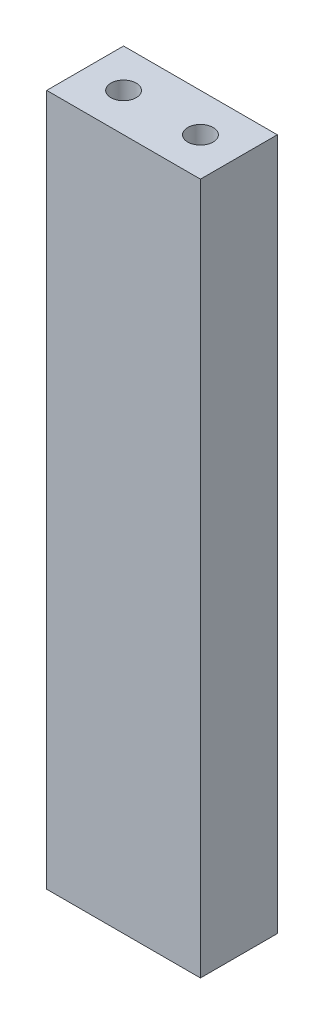
ISO-10303-21;
HEADER;
FILE_DESCRIPTION(('STEP AP214'),'2;1');
FILE_NAME('part.step','',(''),(''),'','','');
FILE_SCHEMA(('AUTOMOTIVE_DESIGN { 1 0 10303 214 1 1 1 1 }'));
ENDSEC;
DATA;
#1=APPLICATION_CONTEXT('core data for automotive mechanical design processes');
#2=APPLICATION_PROTOCOL_DEFINITION('international standard','automotive_design',2000,#1);
#3=PRODUCT_CONTEXT('',#1,'mechanical');
#4=PRODUCT('Part','Part','',(#3));
#5=PRODUCT_RELATED_PRODUCT_CATEGORY('part','',(#4));
#6=PRODUCT_DEFINITION_FORMATION('','',#4);
#7=PRODUCT_DEFINITION_CONTEXT('part definition',#1,'design');
#8=PRODUCT_DEFINITION('design','',#6,#7);
#9=PRODUCT_DEFINITION_SHAPE('','',#8);
#10=(LENGTH_UNIT() NAMED_UNIT(*) SI_UNIT(.MILLI.,.METRE.));
#11=(NAMED_UNIT(*) PLANE_ANGLE_UNIT() SI_UNIT($,.RADIAN.));
#12=(NAMED_UNIT(*) SI_UNIT($,.STERADIAN.) SOLID_ANGLE_UNIT());
#13=UNCERTAINTY_MEASURE_WITH_UNIT(LENGTH_MEASURE(1.E-05),#10,'distance_accuracy_value','');
#14=(GEOMETRIC_REPRESENTATION_CONTEXT(3) GLOBAL_UNCERTAINTY_ASSIGNED_CONTEXT((#13)) GLOBAL_UNIT_ASSIGNED_CONTEXT((#10,
#11,#12)) REPRESENTATION_CONTEXT('',''));
#15=CARTESIAN_POINT('',(0.,0.,0.));
#16=DIRECTION('',(0.,0.,1.));
#17=DIRECTION('',(1.,0.,0.));
#18=AXIS2_PLACEMENT_3D('',#15,#16,#17);
#19=CARTESIAN_POINT('',(10.,90.,5.));
#20=DIRECTION('',(-1.,0.,0.));
#21=DIRECTION('',(0.,0.,1.));
#22=AXIS2_PLACEMENT_3D('',#19,#20,#21);
#23=PLANE('',#22);
#24=DIRECTION('',(0.,0.,-1.));
#25=VECTOR('',#24,1.);
#26=CARTESIAN_POINT('',(10.,0.,5.));
#27=LINE('',#26,#25);
#28=CARTESIAN_POINT('',(10.,0.,5.));
#29=VERTEX_POINT('',#28);
#30=CARTESIAN_POINT('',(10.,0.,-5.));
#31=VERTEX_POINT('',#30);
#32=EDGE_CURVE('E147',#29,#31,#27,.T.);
#33=ORIENTED_EDGE('',*,*,#32,.T.);
#34=DIRECTION('',(0.,-1.,0.));
#35=VECTOR('',#34,1.);
#36=CARTESIAN_POINT('',(10.,90.,-5.));
#37=LINE('',#36,#35);
#38=CARTESIAN_POINT('',(10.,90.,-5.));
#39=VERTEX_POINT('',#38);
#40=EDGE_CURVE('E11',#39,#31,#37,.T.);
#41=ORIENTED_EDGE('',*,*,#40,.F.);
#42=DIRECTION('',(0.,0.,-1.));
#43=VECTOR('',#42,1.);
#44=CARTESIAN_POINT('',(10.,90.,5.));
#45=LINE('',#44,#43);
#46=CARTESIAN_POINT('',(10.,90.,5.));
#47=VERTEX_POINT('',#46);
#48=EDGE_CURVE('E148',#47,#39,#45,.T.);
#49=ORIENTED_EDGE('',*,*,#48,.F.);
#50=DIRECTION('',(0.,-1.,0.));
#51=VECTOR('',#50,1.);
#52=CARTESIAN_POINT('',(10.,90.,5.));
#53=LINE('',#52,#51);
#54=EDGE_CURVE('E158',#47,#29,#53,.T.);
#55=ORIENTED_EDGE('',*,*,#54,.T.);
#56=EDGE_LOOP('',(#33,#41,#49,#55));
#57=FACE_BOUND('',#56,.T.);
#58=ADVANCED_FACE('F45',(#57),#23,.F.);
#59=CARTESIAN_POINT('',(-10.,90.,-5.));
#60=DIRECTION('',(0.,0.,1.));
#61=DIRECTION('',(1.,0.,0.));
#62=AXIS2_PLACEMENT_3D('',#59,#60,#61);
#63=PLANE('',#62);
#64=DIRECTION('',(-1.,0.,0.));
#65=VECTOR('',#64,1.);
#66=CARTESIAN_POINT('',(-10.,0.,-5.));
#67=LINE('',#66,#65);
#68=CARTESIAN_POINT('',(-10.,0.,-5.));
#69=VERTEX_POINT('',#68);
#70=EDGE_CURVE('E162',#31,#69,#67,.T.);
#71=ORIENTED_EDGE('',*,*,#70,.T.);
#72=DIRECTION('',(0.,-1.,0.));
#73=VECTOR('',#72,1.);
#74=CARTESIAN_POINT('',(-10.,90.,-5.));
#75=LINE('',#74,#73);
#76=CARTESIAN_POINT('',(-10.,90.,-5.));
#77=VERTEX_POINT('',#76);
#78=EDGE_CURVE('E54',#77,#69,#75,.T.);
#79=ORIENTED_EDGE('',*,*,#78,.F.);
#80=DIRECTION('',(-1.,0.,0.));
#81=VECTOR('',#80,1.);
#82=CARTESIAN_POINT('',(-10.,90.,-5.));
#83=LINE('',#82,#81);
#84=EDGE_CURVE('E93',#39,#77,#83,.T.);
#85=ORIENTED_EDGE('',*,*,#84,.F.);
#86=ORIENTED_EDGE('',*,*,#40,.T.);
#87=EDGE_LOOP('',(#71,#79,#85,#86));
#88=FACE_BOUND('',#87,.T.);
#89=ADVANCED_FACE('F192',(#88),#63,.F.);
#90=CARTESIAN_POINT('',(-10.,90.,5.));
#91=DIRECTION('',(1.,0.,0.));
#92=DIRECTION('',(0.,0.,-1.));
#93=AXIS2_PLACEMENT_3D('',#90,#91,#92);
#94=PLANE('',#93);
#95=DIRECTION('',(0.,0.,1.));
#96=VECTOR('',#95,1.);
#97=CARTESIAN_POINT('',(-10.,0.,5.));
#98=LINE('',#97,#96);
#99=CARTESIAN_POINT('',(-10.,0.,5.));
#100=VERTEX_POINT('',#99);
#101=EDGE_CURVE('E80',#69,#100,#98,.T.);
#102=ORIENTED_EDGE('',*,*,#101,.T.);
#103=DIRECTION('',(0.,-1.,0.));
#104=VECTOR('',#103,1.);
#105=CARTESIAN_POINT('',(-10.,90.,5.));
#106=LINE('',#105,#104);
#107=CARTESIAN_POINT('',(-10.,90.,5.));
#108=VERTEX_POINT('',#107);
#109=EDGE_CURVE('E171',#108,#100,#106,.T.);
#110=ORIENTED_EDGE('',*,*,#109,.F.);
#111=DIRECTION('',(0.,0.,1.));
#112=VECTOR('',#111,1.);
#113=CARTESIAN_POINT('',(-10.,90.,5.));
#114=LINE('',#113,#112);
#115=EDGE_CURVE('E153',#77,#108,#114,.T.);
#116=ORIENTED_EDGE('',*,*,#115,.F.);
#117=ORIENTED_EDGE('',*,*,#78,.T.);
#118=EDGE_LOOP('',(#102,#110,#116,#117));
#119=FACE_BOUND('',#118,.T.);
#120=ADVANCED_FACE('F175',(#119),#94,.F.);
#121=CARTESIAN_POINT('',(-10.,90.,5.));
#122=DIRECTION('',(0.,0.,-1.));
#123=DIRECTION('',(-1.,0.,0.));
#124=AXIS2_PLACEMENT_3D('',#121,#122,#123);
#125=PLANE('',#124);
#126=DIRECTION('',(1.,0.,0.));
#127=VECTOR('',#126,1.);
#128=CARTESIAN_POINT('',(-10.,0.,5.));
#129=LINE('',#128,#127);
#130=EDGE_CURVE('E86',#100,#29,#129,.T.);
#131=ORIENTED_EDGE('',*,*,#130,.T.);
#132=ORIENTED_EDGE('',*,*,#54,.F.);
#133=DIRECTION('',(1.,0.,0.));
#134=VECTOR('',#133,1.);
#135=CARTESIAN_POINT('',(-10.,90.,5.));
#136=LINE('',#135,#134);
#137=EDGE_CURVE('E62',#108,#47,#136,.T.);
#138=ORIENTED_EDGE('',*,*,#137,.F.);
#139=ORIENTED_EDGE('',*,*,#109,.T.);
#140=EDGE_LOOP('',(#131,#132,#138,#139));
#141=FACE_BOUND('',#140,.T.);
#142=ADVANCED_FACE('F182',(#141),#125,.F.);
#143=CARTESIAN_POINT('',(0.,90.,0.));
#144=DIRECTION('',(0.,-1.,0.));
#145=DIRECTION('',(0.,0.,-1.));
#146=AXIS2_PLACEMENT_3D('',#143,#144,#145);
#147=PLANE('',#146);
#148=CARTESIAN_POINT('',(-5.,90.,0.));
#149=DIRECTION('',(0.,1.,0.));
#150=DIRECTION('',(0.,0.,1.));
#151=AXIS2_PLACEMENT_3D('',#148,#149,#150);
#152=CIRCLE('',#151,1.64999999999999);
#153=CARTESIAN_POINT('',(-5.,90.,1.64999999999999));
#154=VERTEX_POINT('',#153);
#155=EDGE_CURVE('E118',#154,#154,#152,.T.);
#156=ORIENTED_EDGE('',*,*,#155,.F.);
#157=EDGE_LOOP('',(#156));
#158=FACE_BOUND('',#157,.T.);
#159=CARTESIAN_POINT('',(5.,90.,0.));
#160=DIRECTION('',(0.,1.,0.));
#161=DIRECTION('',(0.,0.,1.));
#162=AXIS2_PLACEMENT_3D('',#159,#160,#161);
#163=CIRCLE('',#162,1.64999999999999);
#164=CARTESIAN_POINT('',(5.,90.,1.64999999999999));
#165=VERTEX_POINT('',#164);
#166=EDGE_CURVE('E117',#165,#165,#163,.T.);
#167=ORIENTED_EDGE('',*,*,#166,.F.);
#168=EDGE_LOOP('',(#167));
#169=FACE_BOUND('',#168,.T.);
#170=ORIENTED_EDGE('',*,*,#48,.T.);
#171=ORIENTED_EDGE('',*,*,#84,.T.);
#172=ORIENTED_EDGE('',*,*,#115,.T.);
#173=ORIENTED_EDGE('',*,*,#137,.T.);
#174=EDGE_LOOP('',(#170,#171,#172,#173));
#175=FACE_BOUND('',#174,.T.);
#176=ADVANCED_FACE('F184',(#158,#169,#175),#147,.F.);
#177=CARTESIAN_POINT('',(0.,0.,0.));
#178=DIRECTION('',(0.,-1.,0.));
#179=DIRECTION('',(0.,0.,-1.));
#180=AXIS2_PLACEMENT_3D('',#177,#178,#179);
#181=PLANE('',#180);
#182=CARTESIAN_POINT('',(5.,0.,0.));
#183=DIRECTION('',(0.,-1.,0.));
#184=DIRECTION('',(0.,0.,-1.));
#185=AXIS2_PLACEMENT_3D('',#182,#183,#184);
#186=CIRCLE('',#185,1.64999999999999);
#187=CARTESIAN_POINT('',(5.,0.,-1.64999999999999));
#188=VERTEX_POINT('',#187);
#189=EDGE_CURVE('E131',#188,#188,#186,.T.);
#190=ORIENTED_EDGE('',*,*,#189,.F.);
#191=EDGE_LOOP('',(#190));
#192=FACE_BOUND('',#191,.T.);
#193=CARTESIAN_POINT('',(-5.,0.,0.));
#194=DIRECTION('',(0.,-1.,0.));
#195=DIRECTION('',(0.,0.,-1.));
#196=AXIS2_PLACEMENT_3D('',#193,#194,#195);
#197=CIRCLE('',#196,1.64999999999999);
#198=CARTESIAN_POINT('',(-5.,0.,-1.64999999999999));
#199=VERTEX_POINT('',#198);
#200=EDGE_CURVE('E139',#199,#199,#197,.T.);
#201=ORIENTED_EDGE('',*,*,#200,.F.);
#202=EDGE_LOOP('',(#201));
#203=FACE_BOUND('',#202,.T.);
#204=ORIENTED_EDGE('',*,*,#32,.F.);
#205=ORIENTED_EDGE('',*,*,#130,.F.);
#206=ORIENTED_EDGE('',*,*,#101,.F.);
#207=ORIENTED_EDGE('',*,*,#70,.F.);
#208=EDGE_LOOP('',(#204,#205,#206,#207));
#209=FACE_BOUND('',#208,.T.);
#210=ADVANCED_FACE('F178',(#192,#203,#209),#181,.T.);
#211=CARTESIAN_POINT('',(-5.,15.,0.));
#212=DIRECTION('',(0.,-1.,0.));
#213=DIRECTION('',(0.,0.,-1.));
#214=AXIS2_PLACEMENT_3D('',#211,#212,#213);
#215=CONICAL_SURFACE('',#214,1.65,1.02974425867665);
#216=CARTESIAN_POINT('',(-5.,15.9914200213955,0.));
#217=VERTEX_POINT('',#216);
#218=VERTEX_LOOP('',#217);
#219=FACE_BOUND('',#218,.T.);
#220=CARTESIAN_POINT('',(-5.,15.,0.));
#221=DIRECTION('',(0.,-1.,0.));
#222=DIRECTION('',(0.,0.,-1.));
#223=AXIS2_PLACEMENT_3D('',#220,#221,#222);
#224=CIRCLE('',#223,1.65);
#225=CARTESIAN_POINT('',(-5.,15.,-1.65));
#226=VERTEX_POINT('',#225);
#227=EDGE_CURVE('E143',#226,#226,#224,.T.);
#228=ORIENTED_EDGE('',*,*,#227,.T.);
#229=EDGE_LOOP('',(#228));
#230=FACE_BOUND('',#229,.T.);
#231=ADVANCED_FACE('F220',(#219,#230),#215,.F.);
#232=CARTESIAN_POINT('',(-5.,0.,0.));
#233=DIRECTION('',(0.,-1.,0.));
#234=DIRECTION('',(0.,0.,-1.));
#235=AXIS2_PLACEMENT_3D('',#232,#233,#234);
#236=CYLINDRICAL_SURFACE('',#235,1.64999999999999);
#237=ORIENTED_EDGE('',*,*,#227,.F.);
#238=EDGE_LOOP('',(#237));
#239=FACE_BOUND('',#238,.T.);
#240=ORIENTED_EDGE('',*,*,#200,.T.);
#241=EDGE_LOOP('',(#240));
#242=FACE_BOUND('',#241,.T.);
#243=ADVANCED_FACE('F231',(#239,#242),#236,.F.);
#244=CARTESIAN_POINT('',(5.,15.,0.));
#245=DIRECTION('',(0.,-1.,0.));
#246=DIRECTION('',(0.,0.,-1.));
#247=AXIS2_PLACEMENT_3D('',#244,#245,#246);
#248=CONICAL_SURFACE('',#247,1.65,1.02974425867665);
#249=CARTESIAN_POINT('',(5.,15.9914200213955,0.));
#250=VERTEX_POINT('',#249);
#251=VERTEX_LOOP('',#250);
#252=FACE_BOUND('',#251,.T.);
#253=CARTESIAN_POINT('',(5.,15.,0.));
#254=DIRECTION('',(0.,-1.,0.));
#255=DIRECTION('',(0.,0.,-1.));
#256=AXIS2_PLACEMENT_3D('',#253,#254,#255);
#257=CIRCLE('',#256,1.65);
#258=CARTESIAN_POINT('',(5.,15.,-1.65));
#259=VERTEX_POINT('',#258);
#260=EDGE_CURVE('E135',#259,#259,#257,.T.);
#261=ORIENTED_EDGE('',*,*,#260,.T.);
#262=EDGE_LOOP('',(#261));
#263=FACE_BOUND('',#262,.T.);
#264=ADVANCED_FACE('F242',(#252,#263),#248,.F.);
#265=CARTESIAN_POINT('',(5.,0.,0.));
#266=DIRECTION('',(0.,-1.,0.));
#267=DIRECTION('',(0.,0.,-1.));
#268=AXIS2_PLACEMENT_3D('',#265,#266,#267);
#269=CYLINDRICAL_SURFACE('',#268,1.64999999999999);
#270=ORIENTED_EDGE('',*,*,#260,.F.);
#271=EDGE_LOOP('',(#270));
#272=FACE_BOUND('',#271,.T.);
#273=ORIENTED_EDGE('',*,*,#189,.T.);
#274=EDGE_LOOP('',(#273));
#275=FACE_BOUND('',#274,.T.);
#276=ADVANCED_FACE('F254',(#272,#275),#269,.F.);
#277=CARTESIAN_POINT('',(5.,75.,0.));
#278=DIRECTION('',(0.,1.,0.));
#279=DIRECTION('',(0.,0.,1.));
#280=AXIS2_PLACEMENT_3D('',#277,#278,#279);
#281=CONICAL_SURFACE('',#280,1.65,1.02974425867665);
#282=CARTESIAN_POINT('',(5.,74.0085799786045,0.));
#283=VERTEX_POINT('',#282);
#284=VERTEX_LOOP('',#283);
#285=FACE_BOUND('',#284,.T.);
#286=CARTESIAN_POINT('',(5.,75.,0.));
#287=DIRECTION('',(0.,1.,0.));
#288=DIRECTION('',(0.,0.,1.));
#289=AXIS2_PLACEMENT_3D('',#286,#287,#288);
#290=CIRCLE('',#289,1.65);
#291=CARTESIAN_POINT('',(5.,75.,1.64999999999999));
#292=VERTEX_POINT('',#291);
#293=EDGE_CURVE('E123',#292,#292,#290,.T.);
#294=ORIENTED_EDGE('',*,*,#293,.T.);
#295=EDGE_LOOP('',(#294));
#296=FACE_BOUND('',#295,.T.);
#297=ADVANCED_FACE('F264',(#285,#296),#281,.F.);
#298=CARTESIAN_POINT('',(5.,90.,0.));
#299=DIRECTION('',(0.,1.,0.));
#300=DIRECTION('',(0.,0.,1.));
#301=AXIS2_PLACEMENT_3D('',#298,#299,#300);
#302=CYLINDRICAL_SURFACE('',#301,1.64999999999999);
#303=ORIENTED_EDGE('',*,*,#293,.F.);
#304=EDGE_LOOP('',(#303));
#305=FACE_BOUND('',#304,.T.);
#306=ORIENTED_EDGE('',*,*,#166,.T.);
#307=EDGE_LOOP('',(#306));
#308=FACE_BOUND('',#307,.T.);
#309=ADVANCED_FACE('F110',(#305,#308),#302,.F.);
#310=CARTESIAN_POINT('',(-5.,75.,0.));
#311=DIRECTION('',(0.,1.,0.));
#312=DIRECTION('',(0.,0.,1.));
#313=AXIS2_PLACEMENT_3D('',#310,#311,#312);
#314=CONICAL_SURFACE('',#313,1.65,1.02974425867665);
#315=CARTESIAN_POINT('',(-5.,74.0085799786045,0.));
#316=VERTEX_POINT('',#315);
#317=VERTEX_LOOP('',#316);
#318=FACE_BOUND('',#317,.T.);
#319=CARTESIAN_POINT('',(-5.,75.,0.));
#320=DIRECTION('',(0.,1.,0.));
#321=DIRECTION('',(0.,0.,1.));
#322=AXIS2_PLACEMENT_3D('',#319,#320,#321);
#323=CIRCLE('',#322,1.65);
#324=CARTESIAN_POINT('',(-5.,75.,1.65));
#325=VERTEX_POINT('',#324);
#326=EDGE_CURVE('E114',#325,#325,#323,.T.);
#327=ORIENTED_EDGE('',*,*,#326,.T.);
#328=EDGE_LOOP('',(#327));
#329=FACE_BOUND('',#328,.T.);
#330=ADVANCED_FACE('F106',(#318,#329),#314,.F.);
#331=CARTESIAN_POINT('',(-5.,90.,0.));
#332=DIRECTION('',(0.,1.,0.));
#333=DIRECTION('',(0.,0.,1.));
#334=AXIS2_PLACEMENT_3D('',#331,#332,#333);
#335=CYLINDRICAL_SURFACE('',#334,1.64999999999999);
#336=ORIENTED_EDGE('',*,*,#326,.F.);
#337=EDGE_LOOP('',(#336));
#338=FACE_BOUND('',#337,.T.);
#339=ORIENTED_EDGE('',*,*,#155,.T.);
#340=EDGE_LOOP('',(#339));
#341=FACE_BOUND('',#340,.T.);
#342=ADVANCED_FACE('F109',(#338,#341),#335,.F.);
#343=CLOSED_SHELL('',(#58,#89,#120,#142,#176,#210,#231,#243,#264,#276,#297,#309,#330,#342));
#344=MANIFOLD_SOLID_BREP('B2',#343);
#345=ADVANCED_BREP_SHAPE_REPRESENTATION('',(#18,#344),#14);
#346=SHAPE_DEFINITION_REPRESENTATION(#9,#345);
ENDSEC;
END-ISO-10303-21;
